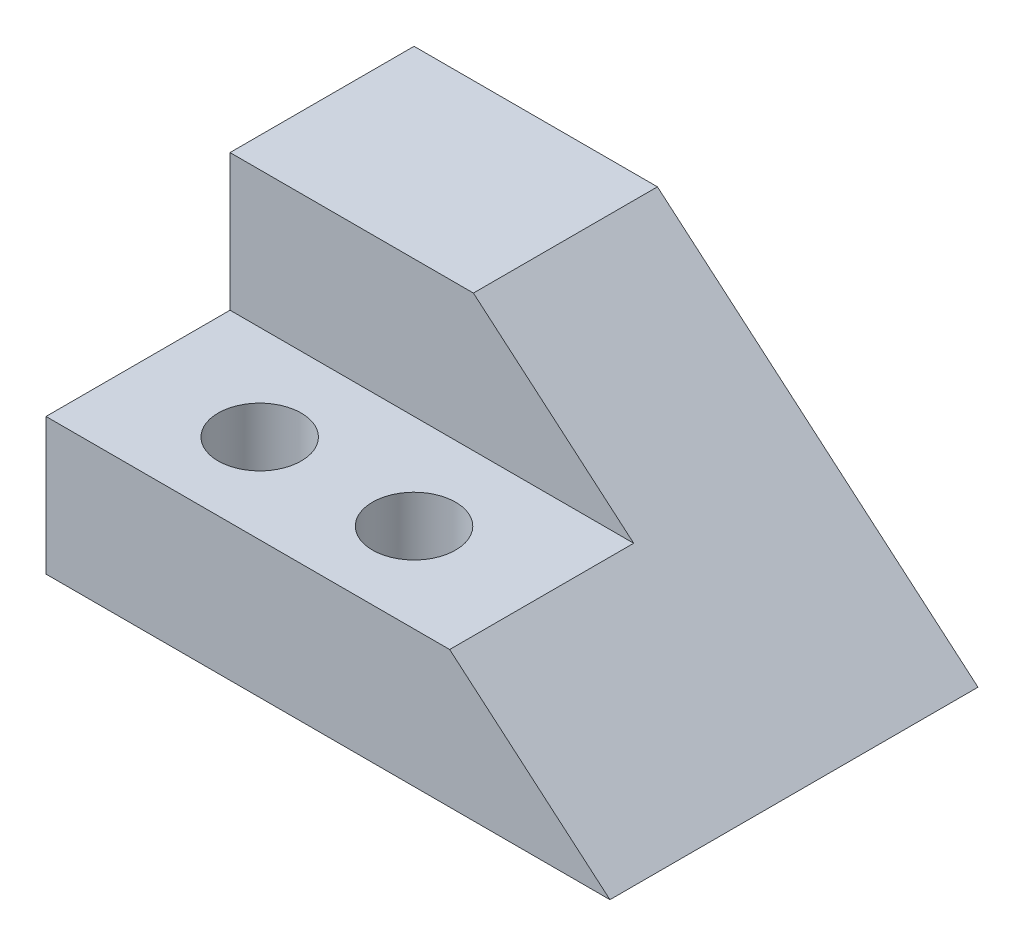
ISO-10303-21;
HEADER;
FILE_DESCRIPTION(('STEP AP214'),'2;1');
FILE_NAME('part.step','',(''),(''),'','','');
FILE_SCHEMA(('AUTOMOTIVE_DESIGN { 1 0 10303 214 1 1 1 1 }'));
ENDSEC;
DATA;
#1=APPLICATION_CONTEXT('core data for automotive mechanical design processes');
#2=APPLICATION_PROTOCOL_DEFINITION('international standard','automotive_design',2000,#1);
#3=PRODUCT_CONTEXT('',#1,'mechanical');
#4=PRODUCT('Part','Part','',(#3));
#5=PRODUCT_RELATED_PRODUCT_CATEGORY('part','',(#4));
#6=PRODUCT_DEFINITION_FORMATION('','',#4);
#7=PRODUCT_DEFINITION_CONTEXT('part definition',#1,'design');
#8=PRODUCT_DEFINITION('design','',#6,#7);
#9=PRODUCT_DEFINITION_SHAPE('','',#8);
#10=(LENGTH_UNIT() NAMED_UNIT(*) SI_UNIT(.MILLI.,.METRE.));
#11=(NAMED_UNIT(*) PLANE_ANGLE_UNIT() SI_UNIT($,.RADIAN.));
#12=(NAMED_UNIT(*) SI_UNIT($,.STERADIAN.) SOLID_ANGLE_UNIT());
#13=UNCERTAINTY_MEASURE_WITH_UNIT(LENGTH_MEASURE(1.E-05),#10,'distance_accuracy_value','');
#14=(GEOMETRIC_REPRESENTATION_CONTEXT(3) GLOBAL_UNCERTAINTY_ASSIGNED_CONTEXT((#13)) GLOBAL_UNIT_ASSIGNED_CONTEXT((#10,
#11,#12)) REPRESENTATION_CONTEXT('',''));
#15=CARTESIAN_POINT('',(0.,0.,0.));
#16=DIRECTION('',(0.,0.,1.));
#17=DIRECTION('',(1.,0.,0.));
#18=AXIS2_PLACEMENT_3D('',#15,#16,#17);
#19=CARTESIAN_POINT('',(0.,46.,-62.));
#20=DIRECTION('',(-1.,0.,0.));
#21=DIRECTION('',(0.,0.,1.));
#22=AXIS2_PLACEMENT_3D('',#19,#20,#21);
#23=PLANE('',#22);
#24=DIRECTION('',(0.,0.,1.));
#25=VECTOR('',#24,1.);
#26=CARTESIAN_POINT('',(0.,23.,0.));
#27=LINE('',#26,#25);
#28=CARTESIAN_POINT('',(0.,23.,-31.));
#29=VERTEX_POINT('',#28);
#30=CARTESIAN_POINT('',(0.,23.,0.));
#31=VERTEX_POINT('',#30);
#32=EDGE_CURVE('E47',#29,#31,#27,.T.);
#33=ORIENTED_EDGE('',*,*,#32,.F.);
#34=DIRECTION('',(0.,-1.,0.));
#35=VECTOR('',#34,1.);
#36=CARTESIAN_POINT('',(0.,46.,-31.));
#37=LINE('',#36,#35);
#38=CARTESIAN_POINT('',(0.,46.,-31.));
#39=VERTEX_POINT('',#38);
#40=EDGE_CURVE('E97',#39,#29,#37,.T.);
#41=ORIENTED_EDGE('',*,*,#40,.F.);
#42=DIRECTION('',(0.,0.,1.));
#43=VECTOR('',#42,1.);
#44=CARTESIAN_POINT('',(0.,46.,-62.));
#45=LINE('',#44,#43);
#46=CARTESIAN_POINT('',(0.,46.,-62.));
#47=VERTEX_POINT('',#46);
#48=EDGE_CURVE('E56',#47,#39,#45,.T.);
#49=ORIENTED_EDGE('',*,*,#48,.F.);
#50=DIRECTION('',(0.,-1.,0.));
#51=VECTOR('',#50,1.);
#52=CARTESIAN_POINT('',(0.,46.,-62.));
#53=LINE('',#52,#51);
#54=CARTESIAN_POINT('',(0.,0.,-62.));
#55=VERTEX_POINT('',#54);
#56=EDGE_CURVE('E131',#47,#55,#53,.T.);
#57=ORIENTED_EDGE('',*,*,#56,.T.);
#58=DIRECTION('',(0.,0.,1.));
#59=VECTOR('',#58,1.);
#60=CARTESIAN_POINT('',(0.,0.,-62.));
#61=LINE('',#60,#59);
#62=CARTESIAN_POINT('',(0.,0.,0.));
#63=VERTEX_POINT('',#62);
#64=EDGE_CURVE('E78',#55,#63,#61,.T.);
#65=ORIENTED_EDGE('',*,*,#64,.T.);
#66=DIRECTION('',(0.,-1.,0.));
#67=VECTOR('',#66,1.);
#68=CARTESIAN_POINT('',(0.,46.,0.));
#69=LINE('',#68,#67);
#70=EDGE_CURVE('E125',#31,#63,#69,.T.);
#71=ORIENTED_EDGE('',*,*,#70,.F.);
#72=EDGE_LOOP('',(#33,#41,#49,#57,#65,#71));
#73=FACE_BOUND('',#72,.T.);
#74=ADVANCED_FACE('F33',(#73),#23,.T.);
#75=CARTESIAN_POINT('',(41.,46.,-62.));
#76=DIRECTION('',(0.,1.,0.));
#77=DIRECTION('',(0.,0.,1.));
#78=AXIS2_PLACEMENT_3D('',#75,#76,#77);
#79=PLANE('',#78);
#80=DIRECTION('',(-1.,0.,0.));
#81=VECTOR('',#80,1.);
#82=CARTESIAN_POINT('',(70.,46.,-31.));
#83=LINE('',#82,#81);
#84=CARTESIAN_POINT('',(41.,46.,-31.));
#85=VERTEX_POINT('',#84);
#86=EDGE_CURVE('E94',#85,#39,#83,.T.);
#87=ORIENTED_EDGE('',*,*,#86,.F.);
#88=DIRECTION('',(0.,0.,1.));
#89=VECTOR('',#88,1.);
#90=CARTESIAN_POINT('',(41.,46.,-62.));
#91=LINE('',#90,#89);
#92=CARTESIAN_POINT('',(41.,46.,-62.));
#93=VERTEX_POINT('',#92);
#94=EDGE_CURVE('E110',#93,#85,#91,.T.);
#95=ORIENTED_EDGE('',*,*,#94,.F.);
#96=DIRECTION('',(-1.,0.,0.));
#97=VECTOR('',#96,1.);
#98=CARTESIAN_POINT('',(41.,46.,-62.));
#99=LINE('',#98,#97);
#100=EDGE_CURVE('E109',#93,#47,#99,.T.);
#101=ORIENTED_EDGE('',*,*,#100,.T.);
#102=ORIENTED_EDGE('',*,*,#48,.T.);
#103=EDGE_LOOP('',(#87,#95,#101,#102));
#104=FACE_BOUND('',#103,.T.);
#105=ADVANCED_FACE('F107',(#104),#79,.T.);
#106=CARTESIAN_POINT('',(95.,0.,-62.));
#107=DIRECTION('',(0.648466455599791,0.761243230486711,0.));
#108=DIRECTION('',(-0.761243230486711,0.648466455599791,0.));
#109=AXIS2_PLACEMENT_3D('',#106,#107,#108);
#110=PLANE('',#109);
#111=DIRECTION('',(0.,0.,-1.));
#112=VECTOR('',#111,1.);
#113=CARTESIAN_POINT('',(68.,23.,-62.));
#114=LINE('',#113,#112);
#115=CARTESIAN_POINT('',(68.,23.,0.));
#116=VERTEX_POINT('',#115);
#117=CARTESIAN_POINT('',(68.,23.,-31.));
#118=VERTEX_POINT('',#117);
#119=EDGE_CURVE('E127',#116,#118,#114,.T.);
#120=ORIENTED_EDGE('',*,*,#119,.F.);
#121=DIRECTION('',(-0.761243230486711,0.648466455599791,0.));
#122=VECTOR('',#121,1.);
#123=CARTESIAN_POINT('',(95.,0.,0.));
#124=LINE('',#123,#122);
#125=CARTESIAN_POINT('',(95.,0.,0.));
#126=VERTEX_POINT('',#125);
#127=EDGE_CURVE('E114',#126,#116,#124,.T.);
#128=ORIENTED_EDGE('',*,*,#127,.F.);
#129=DIRECTION('',(0.,0.,1.));
#130=VECTOR('',#129,1.);
#131=CARTESIAN_POINT('',(95.,0.,-62.));
#132=LINE('',#131,#130);
#133=CARTESIAN_POINT('',(95.,0.,-62.));
#134=VERTEX_POINT('',#133);
#135=EDGE_CURVE('E73',#134,#126,#132,.T.);
#136=ORIENTED_EDGE('',*,*,#135,.F.);
#137=DIRECTION('',(-0.761243230486711,0.648466455599791,0.));
#138=VECTOR('',#137,1.);
#139=CARTESIAN_POINT('',(95.,0.,-62.));
#140=LINE('',#139,#138);
#141=EDGE_CURVE('E118',#134,#93,#140,.T.);
#142=ORIENTED_EDGE('',*,*,#141,.T.);
#143=ORIENTED_EDGE('',*,*,#94,.T.);
#144=DIRECTION('',(-0.761243230486711,0.648466455599791,0.));
#145=VECTOR('',#144,1.);
#146=CARTESIAN_POINT('',(95.,0.,-31.));
#147=LINE('',#146,#145);
#148=EDGE_CURVE('E11',#118,#85,#147,.T.);
#149=ORIENTED_EDGE('',*,*,#148,.F.);
#150=EDGE_LOOP('',(#120,#128,#136,#142,#143,#149));
#151=FACE_BOUND('',#150,.T.);
#152=ADVANCED_FACE('F159',(#151),#110,.T.);
#153=CARTESIAN_POINT('',(0.,0.,-62.));
#154=DIRECTION('',(0.,-1.,0.));
#155=DIRECTION('',(0.,0.,-1.));
#156=AXIS2_PLACEMENT_3D('',#153,#154,#155);
#157=PLANE('',#156);
#158=CARTESIAN_POINT('',(21.,0.,-15.));
#159=DIRECTION('',(0.,-1.,0.));
#160=DIRECTION('',(0.,0.,-1.));
#161=AXIS2_PLACEMENT_3D('',#158,#159,#160);
#162=CIRCLE('',#161,7.);
#163=CARTESIAN_POINT('',(21.,0.,-22.));
#164=VERTEX_POINT('',#163);
#165=EDGE_CURVE('E104',#164,#164,#162,.T.);
#166=ORIENTED_EDGE('',*,*,#165,.F.);
#167=EDGE_LOOP('',(#166));
#168=FACE_BOUND('',#167,.T.);
#169=CARTESIAN_POINT('',(47.,0.,-15.));
#170=DIRECTION('',(0.,-1.,0.));
#171=DIRECTION('',(0.,0.,-1.));
#172=AXIS2_PLACEMENT_3D('',#169,#170,#171);
#173=CIRCLE('',#172,7.);
#174=CARTESIAN_POINT('',(47.,0.,-22.));
#175=VERTEX_POINT('',#174);
#176=EDGE_CURVE('E139',#175,#175,#173,.T.);
#177=ORIENTED_EDGE('',*,*,#176,.F.);
#178=EDGE_LOOP('',(#177));
#179=FACE_BOUND('',#178,.T.);
#180=DIRECTION('',(1.,0.,0.));
#181=VECTOR('',#180,1.);
#182=CARTESIAN_POINT('',(0.,0.,0.));
#183=LINE('',#182,#181);
#184=EDGE_CURVE('E126',#63,#126,#183,.T.);
#185=ORIENTED_EDGE('',*,*,#184,.F.);
#186=ORIENTED_EDGE('',*,*,#64,.F.);
#187=DIRECTION('',(1.,0.,0.));
#188=VECTOR('',#187,1.);
#189=CARTESIAN_POINT('',(0.,0.,-62.));
#190=LINE('',#189,#188);
#191=EDGE_CURVE('E121',#55,#134,#190,.T.);
#192=ORIENTED_EDGE('',*,*,#191,.T.);
#193=ORIENTED_EDGE('',*,*,#135,.T.);
#194=EDGE_LOOP('',(#185,#186,#192,#193));
#195=FACE_BOUND('',#194,.T.);
#196=ADVANCED_FACE('F163',(#168,#179,#195),#157,.T.);
#197=CARTESIAN_POINT('',(0.,0.,-62.));
#198=DIRECTION('',(0.,0.,1.));
#199=DIRECTION('',(1.,0.,0.));
#200=AXIS2_PLACEMENT_3D('',#197,#198,#199);
#201=PLANE('',#200);
#202=ORIENTED_EDGE('',*,*,#56,.F.);
#203=ORIENTED_EDGE('',*,*,#100,.F.);
#204=ORIENTED_EDGE('',*,*,#141,.F.);
#205=ORIENTED_EDGE('',*,*,#191,.F.);
#206=EDGE_LOOP('',(#202,#203,#204,#205));
#207=FACE_BOUND('',#206,.T.);
#208=ADVANCED_FACE('F162',(#207),#201,.F.);
#209=CARTESIAN_POINT('',(0.,0.,0.));
#210=DIRECTION('',(0.,0.,1.));
#211=DIRECTION('',(1.,0.,0.));
#212=AXIS2_PLACEMENT_3D('',#209,#210,#211);
#213=PLANE('',#212);
#214=DIRECTION('',(1.,0.,0.));
#215=VECTOR('',#214,1.);
#216=CARTESIAN_POINT('',(0.,23.,0.));
#217=LINE('',#216,#215);
#218=EDGE_CURVE('E40',#31,#116,#217,.T.);
#219=ORIENTED_EDGE('',*,*,#218,.F.);
#220=ORIENTED_EDGE('',*,*,#70,.T.);
#221=ORIENTED_EDGE('',*,*,#184,.T.);
#222=ORIENTED_EDGE('',*,*,#127,.T.);
#223=EDGE_LOOP('',(#219,#220,#221,#222));
#224=FACE_BOUND('',#223,.T.);
#225=ADVANCED_FACE('F154',(#224),#213,.T.);
#226=CARTESIAN_POINT('',(70.,23.,0.));
#227=DIRECTION('',(0.,-1.,0.));
#228=DIRECTION('',(0.,0.,-1.));
#229=AXIS2_PLACEMENT_3D('',#226,#227,#228);
#230=PLANE('',#229);
#231=CARTESIAN_POINT('',(21.,23.,-15.));
#232=DIRECTION('',(0.,1.,0.));
#233=DIRECTION('',(0.,0.,1.));
#234=AXIS2_PLACEMENT_3D('',#231,#232,#233);
#235=CIRCLE('',#234,7.);
#236=CARTESIAN_POINT('',(21.,23.,-8.));
#237=VERTEX_POINT('',#236);
#238=EDGE_CURVE('E142',#237,#237,#235,.T.);
#239=ORIENTED_EDGE('',*,*,#238,.F.);
#240=EDGE_LOOP('',(#239));
#241=FACE_BOUND('',#240,.T.);
#242=CARTESIAN_POINT('',(47.,23.,-15.));
#243=DIRECTION('',(0.,1.,0.));
#244=DIRECTION('',(0.,0.,1.));
#245=AXIS2_PLACEMENT_3D('',#242,#243,#244);
#246=CIRCLE('',#245,7.);
#247=CARTESIAN_POINT('',(47.,23.,-8.));
#248=VERTEX_POINT('',#247);
#249=EDGE_CURVE('E143',#248,#248,#246,.T.);
#250=ORIENTED_EDGE('',*,*,#249,.F.);
#251=EDGE_LOOP('',(#250));
#252=FACE_BOUND('',#251,.T.);
#253=ORIENTED_EDGE('',*,*,#119,.T.);
#254=DIRECTION('',(-1.,0.,0.));
#255=VECTOR('',#254,1.);
#256=CARTESIAN_POINT('',(70.,23.,-31.));
#257=LINE('',#256,#255);
#258=EDGE_CURVE('E101',#118,#29,#257,.T.);
#259=ORIENTED_EDGE('',*,*,#258,.T.);
#260=ORIENTED_EDGE('',*,*,#32,.T.);
#261=ORIENTED_EDGE('',*,*,#218,.T.);
#262=EDGE_LOOP('',(#253,#259,#260,#261));
#263=FACE_BOUND('',#262,.T.);
#264=ADVANCED_FACE('F151',(#241,#252,#263),#230,.F.);
#265=CARTESIAN_POINT('',(70.,46.,-31.));
#266=DIRECTION('',(0.,0.,-1.));
#267=DIRECTION('',(0.,1.,0.));
#268=AXIS2_PLACEMENT_3D('',#265,#266,#267);
#269=PLANE('',#268);
#270=ORIENTED_EDGE('',*,*,#148,.T.);
#271=ORIENTED_EDGE('',*,*,#86,.T.);
#272=ORIENTED_EDGE('',*,*,#40,.T.);
#273=ORIENTED_EDGE('',*,*,#258,.F.);
#274=EDGE_LOOP('',(#270,#271,#272,#273));
#275=FACE_BOUND('',#274,.T.);
#276=ADVANCED_FACE('F95',(#275),#269,.F.);
#277=CARTESIAN_POINT('',(47.,-39.,-15.));
#278=DIRECTION('',(0.,1.,0.));
#279=DIRECTION('',(0.,0.,1.));
#280=AXIS2_PLACEMENT_3D('',#277,#278,#279);
#281=CYLINDRICAL_SURFACE('',#280,7.);
#282=ORIENTED_EDGE('',*,*,#176,.T.);
#283=EDGE_LOOP('',(#282));
#284=FACE_BOUND('',#283,.T.);
#285=ORIENTED_EDGE('',*,*,#249,.T.);
#286=EDGE_LOOP('',(#285));
#287=FACE_BOUND('',#286,.T.);
#288=ADVANCED_FACE('F185',(#284,#287),#281,.F.);
#289=CARTESIAN_POINT('',(21.,-39.,-15.));
#290=DIRECTION('',(0.,1.,0.));
#291=DIRECTION('',(0.,0.,1.));
#292=AXIS2_PLACEMENT_3D('',#289,#290,#291);
#293=CYLINDRICAL_SURFACE('',#292,7.);
#294=ORIENTED_EDGE('',*,*,#165,.T.);
#295=EDGE_LOOP('',(#294));
#296=FACE_BOUND('',#295,.T.);
#297=ORIENTED_EDGE('',*,*,#238,.T.);
#298=EDGE_LOOP('',(#297));
#299=FACE_BOUND('',#298,.T.);
#300=ADVANCED_FACE('F149',(#296,#299),#293,.F.);
#301=CLOSED_SHELL('',(#74,#105,#152,#196,#208,#225,#264,#276,#288,#300));
#302=MANIFOLD_SOLID_BREP('B2',#301);
#303=ADVANCED_BREP_SHAPE_REPRESENTATION('',(#18,#302),#14);
#304=SHAPE_DEFINITION_REPRESENTATION(#9,#303);
ENDSEC;
END-ISO-10303-21;
